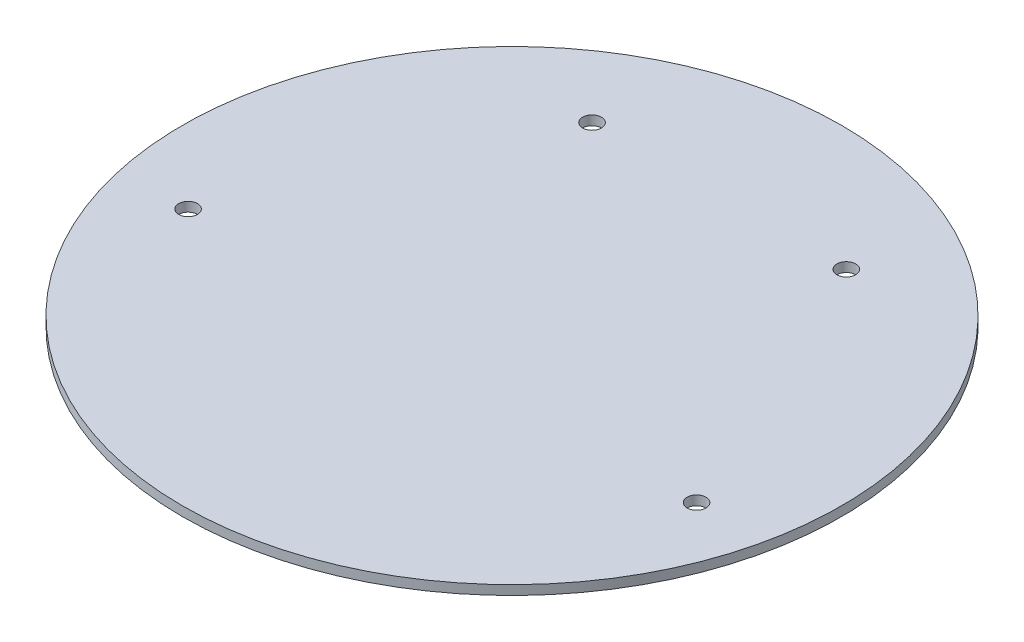
ISO-10303-21;
HEADER;
FILE_DESCRIPTION(('STEP AP214'),'2;1');
FILE_NAME('part.step','',(''),(''),'','','');
FILE_SCHEMA(('AUTOMOTIVE_DESIGN { 1 0 10303 214 1 1 1 1 }'));
ENDSEC;
DATA;
#1=APPLICATION_CONTEXT('core data for automotive mechanical design processes');
#2=APPLICATION_PROTOCOL_DEFINITION('international standard','automotive_design',2000,#1);
#3=PRODUCT_CONTEXT('',#1,'mechanical');
#4=PRODUCT('Part','Part','',(#3));
#5=PRODUCT_RELATED_PRODUCT_CATEGORY('part','',(#4));
#6=PRODUCT_DEFINITION_FORMATION('','',#4);
#7=PRODUCT_DEFINITION_CONTEXT('part definition',#1,'design');
#8=PRODUCT_DEFINITION('design','',#6,#7);
#9=PRODUCT_DEFINITION_SHAPE('','',#8);
#10=(LENGTH_UNIT() NAMED_UNIT(*) SI_UNIT(.MILLI.,.METRE.));
#11=(NAMED_UNIT(*) PLANE_ANGLE_UNIT() SI_UNIT($,.RADIAN.));
#12=(NAMED_UNIT(*) SI_UNIT($,.STERADIAN.) SOLID_ANGLE_UNIT());
#13=UNCERTAINTY_MEASURE_WITH_UNIT(LENGTH_MEASURE(1.E-05),#10,'distance_accuracy_value','');
#14=(GEOMETRIC_REPRESENTATION_CONTEXT(3) GLOBAL_UNCERTAINTY_ASSIGNED_CONTEXT((#13)) GLOBAL_UNIT_ASSIGNED_CONTEXT((#10,
#11,#12)) REPRESENTATION_CONTEXT('',''));
#15=CARTESIAN_POINT('',(0.,0.,0.));
#16=DIRECTION('',(0.,0.,1.));
#17=DIRECTION('',(1.,0.,0.));
#18=AXIS2_PLACEMENT_3D('',#15,#16,#17);
#19=CARTESIAN_POINT('',(0.,0.5,0.));
#20=DIRECTION('',(0.,1.,0.));
#21=DIRECTION('',(0.,0.,1.));
#22=AXIS2_PLACEMENT_3D('',#19,#20,#21);
#23=PLANE('',#22);
#24=CARTESIAN_POINT('',(-13.5,0.5,-22.));
#25=DIRECTION('',(0.,1.,0.));
#26=DIRECTION('',(0.,0.,1.));
#27=AXIS2_PLACEMENT_3D('',#24,#25,#26);
#28=CIRCLE('',#27,1.);
#29=CARTESIAN_POINT('',(-13.5,0.5,-21.));
#30=VERTEX_POINT('',#29);
#31=EDGE_CURVE('E68',#30,#30,#28,.T.);
#32=ORIENTED_EDGE('',*,*,#31,.F.);
#33=EDGE_LOOP('',(#32));
#34=FACE_BOUND('',#33,.T.);
#35=CARTESIAN_POINT('',(-27.,0.5,7.4));
#36=DIRECTION('',(0.,1.,0.));
#37=DIRECTION('',(0.,0.,1.));
#38=AXIS2_PLACEMENT_3D('',#35,#36,#37);
#39=CIRCLE('',#38,1.);
#40=CARTESIAN_POINT('',(-27.,0.5,8.4));
#41=VERTEX_POINT('',#40);
#42=EDGE_CURVE('E54',#41,#41,#39,.T.);
#43=ORIENTED_EDGE('',*,*,#42,.F.);
#44=EDGE_LOOP('',(#43));
#45=FACE_BOUND('',#44,.T.);
#46=CARTESIAN_POINT('',(0.,0.5,0.));
#47=DIRECTION('',(0.,1.,0.));
#48=DIRECTION('',(0.,0.,1.));
#49=AXIS2_PLACEMENT_3D('',#46,#47,#48);
#50=CIRCLE('',#49,35.);
#51=CARTESIAN_POINT('',(0.,0.5,35.));
#52=VERTEX_POINT('',#51);
#53=EDGE_CURVE('E10',#52,#52,#50,.T.);
#54=ORIENTED_EDGE('',*,*,#53,.T.);
#55=EDGE_LOOP('',(#54));
#56=FACE_BOUND('',#55,.T.);
#57=CARTESIAN_POINT('',(27.,0.5,7.4));
#58=DIRECTION('',(0.,1.,0.));
#59=DIRECTION('',(0.,0.,1.));
#60=AXIS2_PLACEMENT_3D('',#57,#58,#59);
#61=CIRCLE('',#60,1.);
#62=CARTESIAN_POINT('',(27.,0.5,8.4));
#63=VERTEX_POINT('',#62);
#64=EDGE_CURVE('E60',#63,#63,#61,.T.);
#65=ORIENTED_EDGE('',*,*,#64,.F.);
#66=EDGE_LOOP('',(#65));
#67=FACE_BOUND('',#66,.T.);
#68=CARTESIAN_POINT('',(13.5,0.5,-22.));
#69=DIRECTION('',(0.,1.,0.));
#70=DIRECTION('',(0.,0.,1.));
#71=AXIS2_PLACEMENT_3D('',#68,#69,#70);
#72=CIRCLE('',#71,1.);
#73=CARTESIAN_POINT('',(13.5,0.5,-21.));
#74=VERTEX_POINT('',#73);
#75=EDGE_CURVE('E76',#74,#74,#72,.T.);
#76=ORIENTED_EDGE('',*,*,#75,.F.);
#77=EDGE_LOOP('',(#76));
#78=FACE_BOUND('',#77,.T.);
#79=ADVANCED_FACE('F41',(#34,#45,#56,#67,#78),#23,.T.);
#80=CARTESIAN_POINT('',(0.,-0.5,0.));
#81=DIRECTION('',(0.,1.,0.));
#82=DIRECTION('',(0.,0.,1.));
#83=AXIS2_PLACEMENT_3D('',#80,#81,#82);
#84=PLANE('',#83);
#85=CARTESIAN_POINT('',(0.,-0.5,0.));
#86=DIRECTION('',(0.,1.,0.));
#87=DIRECTION('',(0.,0.,1.));
#88=AXIS2_PLACEMENT_3D('',#85,#86,#87);
#89=CIRCLE('',#88,35.);
#90=CARTESIAN_POINT('',(0.,-0.5,35.));
#91=VERTEX_POINT('',#90);
#92=EDGE_CURVE('E45',#91,#91,#89,.T.);
#93=ORIENTED_EDGE('',*,*,#92,.F.);
#94=EDGE_LOOP('',(#93));
#95=FACE_BOUND('',#94,.T.);
#96=CARTESIAN_POINT('',(-27.,-0.5,7.4));
#97=DIRECTION('',(0.,1.,0.));
#98=DIRECTION('',(0.,0.,1.));
#99=AXIS2_PLACEMENT_3D('',#96,#97,#98);
#100=CIRCLE('',#99,1.);
#101=CARTESIAN_POINT('',(-27.,-0.5,8.4));
#102=VERTEX_POINT('',#101);
#103=EDGE_CURVE('E56',#102,#102,#100,.T.);
#104=ORIENTED_EDGE('',*,*,#103,.T.);
#105=EDGE_LOOP('',(#104));
#106=FACE_BOUND('',#105,.T.);
#107=CARTESIAN_POINT('',(27.,-0.5,7.4));
#108=DIRECTION('',(0.,1.,0.));
#109=DIRECTION('',(0.,0.,1.));
#110=AXIS2_PLACEMENT_3D('',#107,#108,#109);
#111=CIRCLE('',#110,1.);
#112=CARTESIAN_POINT('',(27.,-0.5,8.4));
#113=VERTEX_POINT('',#112);
#114=EDGE_CURVE('E64',#113,#113,#111,.T.);
#115=ORIENTED_EDGE('',*,*,#114,.T.);
#116=EDGE_LOOP('',(#115));
#117=FACE_BOUND('',#116,.T.);
#118=CARTESIAN_POINT('',(-13.5,-0.5,-22.));
#119=DIRECTION('',(0.,1.,0.));
#120=DIRECTION('',(0.,0.,1.));
#121=AXIS2_PLACEMENT_3D('',#118,#119,#120);
#122=CIRCLE('',#121,1.);
#123=CARTESIAN_POINT('',(-13.5,-0.5,-21.));
#124=VERTEX_POINT('',#123);
#125=EDGE_CURVE('E72',#124,#124,#122,.T.);
#126=ORIENTED_EDGE('',*,*,#125,.T.);
#127=EDGE_LOOP('',(#126));
#128=FACE_BOUND('',#127,.T.);
#129=CARTESIAN_POINT('',(13.5,-0.5,-22.));
#130=DIRECTION('',(0.,1.,0.));
#131=DIRECTION('',(0.,0.,1.));
#132=AXIS2_PLACEMENT_3D('',#129,#130,#131);
#133=CIRCLE('',#132,1.);
#134=CARTESIAN_POINT('',(13.5,-0.5,-21.));
#135=VERTEX_POINT('',#134);
#136=EDGE_CURVE('E80',#135,#135,#133,.T.);
#137=ORIENTED_EDGE('',*,*,#136,.T.);
#138=EDGE_LOOP('',(#137));
#139=FACE_BOUND('',#138,.T.);
#140=ADVANCED_FACE('F92',(#95,#106,#117,#128,#139),#84,.F.);
#141=CARTESIAN_POINT('',(0.,0.5,0.));
#142=DIRECTION('',(0.,-1.,0.));
#143=DIRECTION('',(0.,0.,-1.));
#144=AXIS2_PLACEMENT_3D('',#141,#142,#143);
#145=CYLINDRICAL_SURFACE('',#144,35.);
#146=ORIENTED_EDGE('',*,*,#53,.F.);
#147=EDGE_LOOP('',(#146));
#148=FACE_BOUND('',#147,.T.);
#149=ORIENTED_EDGE('',*,*,#92,.T.);
#150=EDGE_LOOP('',(#149));
#151=FACE_BOUND('',#150,.T.);
#152=ADVANCED_FACE('F43',(#148,#151),#145,.T.);
#153=CARTESIAN_POINT('',(-27.,0.5,7.4));
#154=DIRECTION('',(0.,-1.,0.));
#155=DIRECTION('',(0.,0.,-1.));
#156=AXIS2_PLACEMENT_3D('',#153,#154,#155);
#157=CYLINDRICAL_SURFACE('',#156,1.);
#158=ORIENTED_EDGE('',*,*,#42,.T.);
#159=EDGE_LOOP('',(#158));
#160=FACE_BOUND('',#159,.T.);
#161=ORIENTED_EDGE('',*,*,#103,.F.);
#162=EDGE_LOOP('',(#161));
#163=FACE_BOUND('',#162,.T.);
#164=ADVANCED_FACE('F102',(#160,#163),#157,.F.);
#165=CARTESIAN_POINT('',(27.,0.5,7.4));
#166=DIRECTION('',(0.,-1.,0.));
#167=DIRECTION('',(0.,0.,-1.));
#168=AXIS2_PLACEMENT_3D('',#165,#166,#167);
#169=CYLINDRICAL_SURFACE('',#168,1.);
#170=ORIENTED_EDGE('',*,*,#64,.T.);
#171=EDGE_LOOP('',(#170));
#172=FACE_BOUND('',#171,.T.);
#173=ORIENTED_EDGE('',*,*,#114,.F.);
#174=EDGE_LOOP('',(#173));
#175=FACE_BOUND('',#174,.T.);
#176=ADVANCED_FACE('F105',(#172,#175),#169,.F.);
#177=CARTESIAN_POINT('',(-13.5,0.5,-22.));
#178=DIRECTION('',(0.,-1.,0.));
#179=DIRECTION('',(0.,0.,-1.));
#180=AXIS2_PLACEMENT_3D('',#177,#178,#179);
#181=CYLINDRICAL_SURFACE('',#180,1.);
#182=ORIENTED_EDGE('',*,*,#31,.T.);
#183=EDGE_LOOP('',(#182));
#184=FACE_BOUND('',#183,.T.);
#185=ORIENTED_EDGE('',*,*,#125,.F.);
#186=EDGE_LOOP('',(#185));
#187=FACE_BOUND('',#186,.T.);
#188=ADVANCED_FACE('F109',(#184,#187),#181,.F.);
#189=CARTESIAN_POINT('',(13.5,0.5,-22.));
#190=DIRECTION('',(0.,-1.,0.));
#191=DIRECTION('',(0.,0.,-1.));
#192=AXIS2_PLACEMENT_3D('',#189,#190,#191);
#193=CYLINDRICAL_SURFACE('',#192,1.);
#194=ORIENTED_EDGE('',*,*,#75,.T.);
#195=EDGE_LOOP('',(#194));
#196=FACE_BOUND('',#195,.T.);
#197=ORIENTED_EDGE('',*,*,#136,.F.);
#198=EDGE_LOOP('',(#197));
#199=FACE_BOUND('',#198,.T.);
#200=ADVANCED_FACE('F88',(#196,#199),#193,.F.);
#201=CLOSED_SHELL('',(#79,#140,#152,#164,#176,#188,#200));
#202=MANIFOLD_SOLID_BREP('B2',#201);
#203=ADVANCED_BREP_SHAPE_REPRESENTATION('',(#18,#202),#14);
#204=SHAPE_DEFINITION_REPRESENTATION(#9,#203);
ENDSEC;
END-ISO-10303-21;
